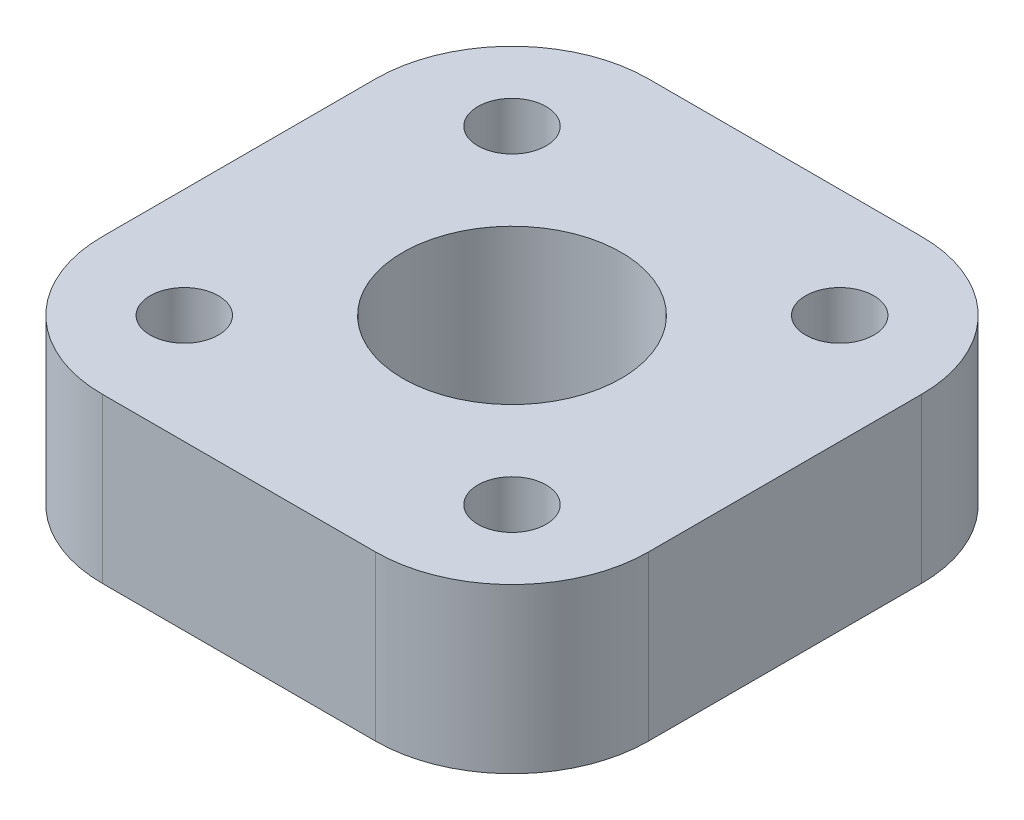
ISO-10303-21;
HEADER;
FILE_DESCRIPTION(('STEP AP214'),'2;1');
FILE_NAME('part.step','',(''),(''),'','','');
FILE_SCHEMA(('AUTOMOTIVE_DESIGN { 1 0 10303 214 1 1 1 1 }'));
ENDSEC;
DATA;
#1=APPLICATION_CONTEXT('core data for automotive mechanical design processes');
#2=APPLICATION_PROTOCOL_DEFINITION('international standard','automotive_design',2000,#1);
#3=PRODUCT_CONTEXT('',#1,'mechanical');
#4=PRODUCT('Part','Part','',(#3));
#5=PRODUCT_RELATED_PRODUCT_CATEGORY('part','',(#4));
#6=PRODUCT_DEFINITION_FORMATION('','',#4);
#7=PRODUCT_DEFINITION_CONTEXT('part definition',#1,'design');
#8=PRODUCT_DEFINITION('design','',#6,#7);
#9=PRODUCT_DEFINITION_SHAPE('','',#8);
#10=(LENGTH_UNIT() NAMED_UNIT(*) SI_UNIT(.MILLI.,.METRE.));
#11=(NAMED_UNIT(*) PLANE_ANGLE_UNIT() SI_UNIT($,.RADIAN.));
#12=(NAMED_UNIT(*) SI_UNIT($,.STERADIAN.) SOLID_ANGLE_UNIT());
#13=UNCERTAINTY_MEASURE_WITH_UNIT(LENGTH_MEASURE(1.E-05),#10,'distance_accuracy_value','');
#14=(GEOMETRIC_REPRESENTATION_CONTEXT(3) GLOBAL_UNCERTAINTY_ASSIGNED_CONTEXT((#13)) GLOBAL_UNIT_ASSIGNED_CONTEXT((#10,
#11,#12)) REPRESENTATION_CONTEXT('',''));
#15=CARTESIAN_POINT('',(0.,0.,0.));
#16=DIRECTION('',(0.,0.,1.));
#17=DIRECTION('',(1.,0.,0.));
#18=AXIS2_PLACEMENT_3D('',#15,#16,#17);
#19=CARTESIAN_POINT('',(0.,3.,0.));
#20=DIRECTION('',(0.,-1.,0.));
#21=DIRECTION('',(0.,0.,-1.));
#22=AXIS2_PLACEMENT_3D('',#19,#20,#21);
#23=PLANE('',#22);
#24=CARTESIAN_POINT('',(-6.,3.,6.));
#25=DIRECTION('',(0.,1.,0.));
#26=DIRECTION('',(0.,0.,1.));
#27=AXIS2_PLACEMENT_3D('',#24,#25,#26);
#28=CIRCLE('',#27,1.24999999999999);
#29=CARTESIAN_POINT('',(-6.,3.,7.24999999999999));
#30=VERTEX_POINT('',#29);
#31=EDGE_CURVE('E200',#30,#30,#28,.T.);
#32=ORIENTED_EDGE('',*,*,#31,.F.);
#33=EDGE_LOOP('',(#32));
#34=FACE_BOUND('',#33,.T.);
#35=DIRECTION('',(0.,0.,-1.));
#36=VECTOR('',#35,1.);
#37=CARTESIAN_POINT('',(10.,3.,10.));
#38=LINE('',#37,#36);
#39=CARTESIAN_POINT('',(10.,3.,5.));
#40=VERTEX_POINT('',#39);
#41=CARTESIAN_POINT('',(10.,3.,-5.));
#42=VERTEX_POINT('',#41);
#43=EDGE_CURVE('E143',#40,#42,#38,.T.);
#44=ORIENTED_EDGE('',*,*,#43,.T.);
#45=CARTESIAN_POINT('',(5.,3.,-5.));
#46=DIRECTION('',(0.,-1.,0.));
#47=DIRECTION('',(0.,0.,-1.));
#48=AXIS2_PLACEMENT_3D('',#45,#46,#47);
#49=CIRCLE('',#48,5.);
#50=CARTESIAN_POINT('',(5.,3.,-10.));
#51=VERTEX_POINT('',#50);
#52=EDGE_CURVE('E157',#42,#51,#49,.F.);
#53=ORIENTED_EDGE('',*,*,#52,.T.);
#54=DIRECTION('',(-1.,0.,0.));
#55=VECTOR('',#54,1.);
#56=CARTESIAN_POINT('',(-10.,3.,-10.));
#57=LINE('',#56,#55);
#58=CARTESIAN_POINT('',(-5.,3.,-10.));
#59=VERTEX_POINT('',#58);
#60=EDGE_CURVE('E124',#51,#59,#57,.T.);
#61=ORIENTED_EDGE('',*,*,#60,.T.);
#62=CARTESIAN_POINT('',(-5.,3.,-5.));
#63=DIRECTION('',(0.,-1.,0.));
#64=DIRECTION('',(0.,0.,-1.));
#65=AXIS2_PLACEMENT_3D('',#62,#63,#64);
#66=CIRCLE('',#65,5.);
#67=CARTESIAN_POINT('',(-10.,3.,-5.));
#68=VERTEX_POINT('',#67);
#69=EDGE_CURVE('E153',#59,#68,#66,.F.);
#70=ORIENTED_EDGE('',*,*,#69,.T.);
#71=DIRECTION('',(0.,0.,1.));
#72=VECTOR('',#71,1.);
#73=CARTESIAN_POINT('',(-10.,3.,10.));
#74=LINE('',#73,#72);
#75=CARTESIAN_POINT('',(-10.,3.,5.));
#76=VERTEX_POINT('',#75);
#77=EDGE_CURVE('E166',#68,#76,#74,.T.);
#78=ORIENTED_EDGE('',*,*,#77,.T.);
#79=CARTESIAN_POINT('',(-5.,3.,5.));
#80=DIRECTION('',(0.,-1.,0.));
#81=DIRECTION('',(0.,0.,-1.));
#82=AXIS2_PLACEMENT_3D('',#79,#80,#81);
#83=CIRCLE('',#82,5.);
#84=CARTESIAN_POINT('',(-5.,3.,10.));
#85=VERTEX_POINT('',#84);
#86=EDGE_CURVE('E59',#76,#85,#83,.F.);
#87=ORIENTED_EDGE('',*,*,#86,.T.);
#88=DIRECTION('',(1.,0.,0.));
#89=VECTOR('',#88,1.);
#90=CARTESIAN_POINT('',(-10.,3.,10.));
#91=LINE('',#90,#89);
#92=CARTESIAN_POINT('',(5.,3.,10.));
#93=VERTEX_POINT('',#92);
#94=EDGE_CURVE('E144',#85,#93,#91,.T.);
#95=ORIENTED_EDGE('',*,*,#94,.T.);
#96=CARTESIAN_POINT('',(5.,3.,5.));
#97=DIRECTION('',(0.,-1.,0.));
#98=DIRECTION('',(0.,0.,-1.));
#99=AXIS2_PLACEMENT_3D('',#96,#97,#98);
#100=CIRCLE('',#99,5.);
#101=EDGE_CURVE('E155',#93,#40,#100,.F.);
#102=ORIENTED_EDGE('',*,*,#101,.T.);
#103=EDGE_LOOP('',(#44,#53,#61,#70,#78,#87,#95,#102));
#104=FACE_BOUND('',#103,.T.);
#105=CARTESIAN_POINT('',(0.,3.,0.));
#106=DIRECTION('',(0.,1.,0.));
#107=DIRECTION('',(0.,0.,1.));
#108=AXIS2_PLACEMENT_3D('',#105,#106,#107);
#109=CIRCLE('',#108,4.);
#110=CARTESIAN_POINT('',(0.,3.,4.));
#111=VERTEX_POINT('',#110);
#112=EDGE_CURVE('E138',#111,#111,#109,.T.);
#113=ORIENTED_EDGE('',*,*,#112,.F.);
#114=EDGE_LOOP('',(#113));
#115=FACE_BOUND('',#114,.T.);
#116=CARTESIAN_POINT('',(6.,3.,6.));
#117=DIRECTION('',(0.,1.,0.));
#118=DIRECTION('',(0.,0.,1.));
#119=AXIS2_PLACEMENT_3D('',#116,#117,#118);
#120=CIRCLE('',#119,1.24999999999999);
#121=CARTESIAN_POINT('',(6.,3.,7.24999999999999));
#122=VERTEX_POINT('',#121);
#123=EDGE_CURVE('E194',#122,#122,#120,.T.);
#124=ORIENTED_EDGE('',*,*,#123,.F.);
#125=EDGE_LOOP('',(#124));
#126=FACE_BOUND('',#125,.T.);
#127=CARTESIAN_POINT('',(-6.,3.,-6.));
#128=DIRECTION('',(0.,1.,0.));
#129=DIRECTION('',(0.,0.,1.));
#130=AXIS2_PLACEMENT_3D('',#127,#128,#129);
#131=CIRCLE('',#130,1.24999999999999);
#132=CARTESIAN_POINT('',(-6.,3.,-4.75000000000001));
#133=VERTEX_POINT('',#132);
#134=EDGE_CURVE('E206',#133,#133,#131,.T.);
#135=ORIENTED_EDGE('',*,*,#134,.F.);
#136=EDGE_LOOP('',(#135));
#137=FACE_BOUND('',#136,.T.);
#138=CARTESIAN_POINT('',(6.,3.,-6.));
#139=DIRECTION('',(0.,1.,0.));
#140=DIRECTION('',(0.,0.,1.));
#141=AXIS2_PLACEMENT_3D('',#138,#139,#140);
#142=CIRCLE('',#141,1.24999999999999);
#143=CARTESIAN_POINT('',(6.,3.,-4.75000000000001));
#144=VERTEX_POINT('',#143);
#145=EDGE_CURVE('E212',#144,#144,#142,.T.);
#146=ORIENTED_EDGE('',*,*,#145,.F.);
#147=EDGE_LOOP('',(#146));
#148=FACE_BOUND('',#147,.T.);
#149=ADVANCED_FACE('F37',(#34,#104,#115,#126,#137,#148),#23,.F.);
#150=CARTESIAN_POINT('',(0.,-3.,0.));
#151=DIRECTION('',(0.,-1.,0.));
#152=DIRECTION('',(0.,0.,-1.));
#153=AXIS2_PLACEMENT_3D('',#150,#151,#152);
#154=PLANE('',#153);
#155=CARTESIAN_POINT('',(6.,-3.,-6.));
#156=DIRECTION('',(0.,-1.,0.));
#157=DIRECTION('',(0.,0.,-1.));
#158=AXIS2_PLACEMENT_3D('',#155,#156,#157);
#159=CIRCLE('',#158,1.24999999999999);
#160=CARTESIAN_POINT('',(6.,-3.,-7.24999999999999));
#161=VERTEX_POINT('',#160);
#162=EDGE_CURVE('E209',#161,#161,#159,.T.);
#163=ORIENTED_EDGE('',*,*,#162,.F.);
#164=EDGE_LOOP('',(#163));
#165=FACE_BOUND('',#164,.T.);
#166=CARTESIAN_POINT('',(-6.,-3.,-6.));
#167=DIRECTION('',(0.,-1.,0.));
#168=DIRECTION('',(0.,0.,-1.));
#169=AXIS2_PLACEMENT_3D('',#166,#167,#168);
#170=CIRCLE('',#169,1.24999999999999);
#171=CARTESIAN_POINT('',(-6.,-3.,-7.24999999999999));
#172=VERTEX_POINT('',#171);
#173=EDGE_CURVE('E203',#172,#172,#170,.T.);
#174=ORIENTED_EDGE('',*,*,#173,.F.);
#175=EDGE_LOOP('',(#174));
#176=FACE_BOUND('',#175,.T.);
#177=CARTESIAN_POINT('',(-6.,-3.,6.));
#178=DIRECTION('',(0.,-1.,0.));
#179=DIRECTION('',(0.,0.,-1.));
#180=AXIS2_PLACEMENT_3D('',#177,#178,#179);
#181=CIRCLE('',#180,1.24999999999999);
#182=CARTESIAN_POINT('',(-6.,-3.,4.75000000000001));
#183=VERTEX_POINT('',#182);
#184=EDGE_CURVE('E197',#183,#183,#181,.T.);
#185=ORIENTED_EDGE('',*,*,#184,.F.);
#186=EDGE_LOOP('',(#185));
#187=FACE_BOUND('',#186,.T.);
#188=CARTESIAN_POINT('',(6.,-3.,6.));
#189=DIRECTION('',(0.,-1.,0.));
#190=DIRECTION('',(0.,0.,-1.));
#191=AXIS2_PLACEMENT_3D('',#188,#189,#190);
#192=CIRCLE('',#191,1.24999999999999);
#193=CARTESIAN_POINT('',(6.,-3.,4.75000000000001));
#194=VERTEX_POINT('',#193);
#195=EDGE_CURVE('E189',#194,#194,#192,.T.);
#196=ORIENTED_EDGE('',*,*,#195,.F.);
#197=EDGE_LOOP('',(#196));
#198=FACE_BOUND('',#197,.T.);
#199=DIRECTION('',(-1.,0.,0.));
#200=VECTOR('',#199,1.);
#201=CARTESIAN_POINT('',(-10.,-3.,-10.));
#202=LINE('',#201,#200);
#203=CARTESIAN_POINT('',(5.,-3.,-10.));
#204=VERTEX_POINT('',#203);
#205=CARTESIAN_POINT('',(-5.,-3.,-10.));
#206=VERTEX_POINT('',#205);
#207=EDGE_CURVE('E121',#204,#206,#202,.T.);
#208=ORIENTED_EDGE('',*,*,#207,.F.);
#209=CARTESIAN_POINT('',(5.,-3.,-5.));
#210=DIRECTION('',(0.,-1.,0.));
#211=DIRECTION('',(0.,0.,-1.));
#212=AXIS2_PLACEMENT_3D('',#209,#210,#211);
#213=CIRCLE('',#212,5.);
#214=CARTESIAN_POINT('',(10.,-3.,-5.));
#215=VERTEX_POINT('',#214);
#216=EDGE_CURVE('E104',#204,#215,#213,.T.);
#217=ORIENTED_EDGE('',*,*,#216,.T.);
#218=DIRECTION('',(0.,0.,-1.));
#219=VECTOR('',#218,1.);
#220=CARTESIAN_POINT('',(10.,-3.,10.));
#221=LINE('',#220,#219);
#222=CARTESIAN_POINT('',(10.,-3.,5.));
#223=VERTEX_POINT('',#222);
#224=EDGE_CURVE('E133',#223,#215,#221,.T.);
#225=ORIENTED_EDGE('',*,*,#224,.F.);
#226=CARTESIAN_POINT('',(5.,-3.,5.));
#227=DIRECTION('',(0.,-1.,0.));
#228=DIRECTION('',(0.,0.,-1.));
#229=AXIS2_PLACEMENT_3D('',#226,#227,#228);
#230=CIRCLE('',#229,5.);
#231=CARTESIAN_POINT('',(5.,-3.,10.));
#232=VERTEX_POINT('',#231);
#233=EDGE_CURVE('E115',#223,#232,#230,.T.);
#234=ORIENTED_EDGE('',*,*,#233,.T.);
#235=DIRECTION('',(1.,0.,0.));
#236=VECTOR('',#235,1.);
#237=CARTESIAN_POINT('',(-10.,-3.,10.));
#238=LINE('',#237,#236);
#239=CARTESIAN_POINT('',(-5.,-3.,10.));
#240=VERTEX_POINT('',#239);
#241=EDGE_CURVE('E136',#240,#232,#238,.T.);
#242=ORIENTED_EDGE('',*,*,#241,.F.);
#243=CARTESIAN_POINT('',(-5.,-3.,5.));
#244=DIRECTION('',(0.,-1.,0.));
#245=DIRECTION('',(0.,0.,-1.));
#246=AXIS2_PLACEMENT_3D('',#243,#244,#245);
#247=CIRCLE('',#246,5.);
#248=CARTESIAN_POINT('',(-10.,-3.,5.));
#249=VERTEX_POINT('',#248);
#250=EDGE_CURVE('E125',#240,#249,#247,.T.);
#251=ORIENTED_EDGE('',*,*,#250,.T.);
#252=DIRECTION('',(0.,0.,1.));
#253=VECTOR('',#252,1.);
#254=CARTESIAN_POINT('',(-10.,-3.,10.));
#255=LINE('',#254,#253);
#256=CARTESIAN_POINT('',(-10.,-3.,-5.));
#257=VERTEX_POINT('',#256);
#258=EDGE_CURVE('E132',#257,#249,#255,.T.);
#259=ORIENTED_EDGE('',*,*,#258,.F.);
#260=CARTESIAN_POINT('',(-5.,-3.,-5.));
#261=DIRECTION('',(0.,-1.,0.));
#262=DIRECTION('',(0.,0.,-1.));
#263=AXIS2_PLACEMENT_3D('',#260,#261,#262);
#264=CIRCLE('',#263,5.);
#265=EDGE_CURVE('E131',#257,#206,#264,.T.);
#266=ORIENTED_EDGE('',*,*,#265,.T.);
#267=EDGE_LOOP('',(#208,#217,#225,#234,#242,#251,#259,#266));
#268=FACE_BOUND('',#267,.T.);
#269=CARTESIAN_POINT('',(0.,-3.,0.));
#270=DIRECTION('',(0.,1.,0.));
#271=DIRECTION('',(0.,0.,1.));
#272=AXIS2_PLACEMENT_3D('',#269,#270,#271);
#273=CIRCLE('',#272,4.);
#274=CARTESIAN_POINT('',(0.,-3.,4.));
#275=VERTEX_POINT('',#274);
#276=EDGE_CURVE('E186',#275,#275,#273,.T.);
#277=ORIENTED_EDGE('',*,*,#276,.T.);
#278=EDGE_LOOP('',(#277));
#279=FACE_BOUND('',#278,.T.);
#280=ADVANCED_FACE('F128',(#165,#176,#187,#198,#268,#279),#154,.T.);
#281=CARTESIAN_POINT('',(10.,3.,10.));
#282=DIRECTION('',(-1.,0.,0.));
#283=DIRECTION('',(0.,0.,1.));
#284=AXIS2_PLACEMENT_3D('',#281,#282,#283);
#285=PLANE('',#284);
#286=ORIENTED_EDGE('',*,*,#224,.T.);
#287=DIRECTION('',(0.,-1.,0.));
#288=VECTOR('',#287,1.);
#289=CARTESIAN_POINT('',(10.,3.,-5.));
#290=LINE('',#289,#288);
#291=EDGE_CURVE('E109',#215,#42,#290,.F.);
#292=ORIENTED_EDGE('',*,*,#291,.T.);
#293=ORIENTED_EDGE('',*,*,#43,.F.);
#294=DIRECTION('',(0.,-1.,0.));
#295=VECTOR('',#294,1.);
#296=CARTESIAN_POINT('',(10.,3.,5.));
#297=LINE('',#296,#295);
#298=EDGE_CURVE('E114',#40,#223,#297,.T.);
#299=ORIENTED_EDGE('',*,*,#298,.T.);
#300=EDGE_LOOP('',(#286,#292,#293,#299));
#301=FACE_BOUND('',#300,.T.);
#302=ADVANCED_FACE('F182',(#301),#285,.F.);
#303=CARTESIAN_POINT('',(-10.,3.,-10.));
#304=DIRECTION('',(0.,0.,1.));
#305=DIRECTION('',(1.,0.,0.));
#306=AXIS2_PLACEMENT_3D('',#303,#304,#305);
#307=PLANE('',#306);
#308=ORIENTED_EDGE('',*,*,#60,.F.);
#309=DIRECTION('',(0.,-1.,0.));
#310=VECTOR('',#309,1.);
#311=CARTESIAN_POINT('',(5.,3.,-10.));
#312=LINE('',#311,#310);
#313=EDGE_CURVE('E108',#51,#204,#312,.T.);
#314=ORIENTED_EDGE('',*,*,#313,.T.);
#315=ORIENTED_EDGE('',*,*,#207,.T.);
#316=DIRECTION('',(0.,-1.,0.));
#317=VECTOR('',#316,1.);
#318=CARTESIAN_POINT('',(-5.,3.,-10.));
#319=LINE('',#318,#317);
#320=EDGE_CURVE('E126',#206,#59,#319,.F.);
#321=ORIENTED_EDGE('',*,*,#320,.T.);
#322=EDGE_LOOP('',(#308,#314,#315,#321));
#323=FACE_BOUND('',#322,.T.);
#324=ADVANCED_FACE('F120',(#323),#307,.F.);
#325=CARTESIAN_POINT('',(-10.,3.,10.));
#326=DIRECTION('',(1.,0.,0.));
#327=DIRECTION('',(0.,0.,-1.));
#328=AXIS2_PLACEMENT_3D('',#325,#326,#327);
#329=PLANE('',#328);
#330=ORIENTED_EDGE('',*,*,#77,.F.);
#331=DIRECTION('',(0.,-1.,0.));
#332=VECTOR('',#331,1.);
#333=CARTESIAN_POINT('',(-10.,3.,-5.));
#334=LINE('',#333,#332);
#335=EDGE_CURVE('E11',#68,#257,#334,.T.);
#336=ORIENTED_EDGE('',*,*,#335,.T.);
#337=ORIENTED_EDGE('',*,*,#258,.T.);
#338=DIRECTION('',(0.,-1.,0.));
#339=VECTOR('',#338,1.);
#340=CARTESIAN_POINT('',(-10.,3.,5.));
#341=LINE('',#340,#339);
#342=EDGE_CURVE('E45',#249,#76,#341,.F.);
#343=ORIENTED_EDGE('',*,*,#342,.T.);
#344=EDGE_LOOP('',(#330,#336,#337,#343));
#345=FACE_BOUND('',#344,.T.);
#346=ADVANCED_FACE('F165',(#345),#329,.F.);
#347=CARTESIAN_POINT('',(-10.,3.,10.));
#348=DIRECTION('',(0.,0.,-1.));
#349=DIRECTION('',(-1.,0.,0.));
#350=AXIS2_PLACEMENT_3D('',#347,#348,#349);
#351=PLANE('',#350);
#352=ORIENTED_EDGE('',*,*,#241,.T.);
#353=DIRECTION('',(0.,-1.,0.));
#354=VECTOR('',#353,1.);
#355=CARTESIAN_POINT('',(5.,3.,10.));
#356=LINE('',#355,#354);
#357=EDGE_CURVE('E52',#232,#93,#356,.F.);
#358=ORIENTED_EDGE('',*,*,#357,.T.);
#359=ORIENTED_EDGE('',*,*,#94,.F.);
#360=DIRECTION('',(0.,-1.,0.));
#361=VECTOR('',#360,1.);
#362=CARTESIAN_POINT('',(-5.,3.,10.));
#363=LINE('',#362,#361);
#364=EDGE_CURVE('E159',#85,#240,#363,.T.);
#365=ORIENTED_EDGE('',*,*,#364,.T.);
#366=EDGE_LOOP('',(#352,#358,#359,#365));
#367=FACE_BOUND('',#366,.T.);
#368=ADVANCED_FACE('F175',(#367),#351,.F.);
#369=CARTESIAN_POINT('',(0.,3.,0.));
#370=DIRECTION('',(0.,-1.,0.));
#371=DIRECTION('',(0.,0.,-1.));
#372=AXIS2_PLACEMENT_3D('',#369,#370,#371);
#373=CYLINDRICAL_SURFACE('',#372,4.);
#374=ORIENTED_EDGE('',*,*,#112,.T.);
#375=EDGE_LOOP('',(#374));
#376=FACE_BOUND('',#375,.T.);
#377=ORIENTED_EDGE('',*,*,#276,.F.);
#378=EDGE_LOOP('',(#377));
#379=FACE_BOUND('',#378,.T.);
#380=ADVANCED_FACE('F229',(#376,#379),#373,.F.);
#381=CARTESIAN_POINT('',(6.,3.,6.));
#382=DIRECTION('',(0.,1.,0.));
#383=DIRECTION('',(0.,0.,1.));
#384=AXIS2_PLACEMENT_3D('',#381,#382,#383);
#385=CYLINDRICAL_SURFACE('',#384,1.24999999999999);
#386=ORIENTED_EDGE('',*,*,#123,.T.);
#387=EDGE_LOOP('',(#386));
#388=FACE_BOUND('',#387,.T.);
#389=ORIENTED_EDGE('',*,*,#195,.T.);
#390=EDGE_LOOP('',(#389));
#391=FACE_BOUND('',#390,.T.);
#392=ADVANCED_FACE('F337',(#388,#391),#385,.F.);
#393=CARTESIAN_POINT('',(-6.,3.,6.));
#394=DIRECTION('',(0.,1.,0.));
#395=DIRECTION('',(0.,0.,1.));
#396=AXIS2_PLACEMENT_3D('',#393,#394,#395);
#397=CYLINDRICAL_SURFACE('',#396,1.24999999999999);
#398=ORIENTED_EDGE('',*,*,#31,.T.);
#399=EDGE_LOOP('',(#398));
#400=FACE_BOUND('',#399,.T.);
#401=ORIENTED_EDGE('',*,*,#184,.T.);
#402=EDGE_LOOP('',(#401));
#403=FACE_BOUND('',#402,.T.);
#404=ADVANCED_FACE('F325',(#400,#403),#397,.F.);
#405=CARTESIAN_POINT('',(-6.,3.,-6.));
#406=DIRECTION('',(0.,1.,0.));
#407=DIRECTION('',(0.,0.,1.));
#408=AXIS2_PLACEMENT_3D('',#405,#406,#407);
#409=CYLINDRICAL_SURFACE('',#408,1.24999999999999);
#410=ORIENTED_EDGE('',*,*,#134,.T.);
#411=EDGE_LOOP('',(#410));
#412=FACE_BOUND('',#411,.T.);
#413=ORIENTED_EDGE('',*,*,#173,.T.);
#414=EDGE_LOOP('',(#413));
#415=FACE_BOUND('',#414,.T.);
#416=ADVANCED_FACE('F315',(#412,#415),#409,.F.);
#417=CARTESIAN_POINT('',(6.,3.,-6.));
#418=DIRECTION('',(0.,1.,0.));
#419=DIRECTION('',(0.,0.,1.));
#420=AXIS2_PLACEMENT_3D('',#417,#418,#419);
#421=CYLINDRICAL_SURFACE('',#420,1.24999999999999);
#422=ORIENTED_EDGE('',*,*,#145,.T.);
#423=EDGE_LOOP('',(#422));
#424=FACE_BOUND('',#423,.T.);
#425=ORIENTED_EDGE('',*,*,#162,.T.);
#426=EDGE_LOOP('',(#425));
#427=FACE_BOUND('',#426,.T.);
#428=ADVANCED_FACE('F216',(#424,#427),#421,.F.);
#429=CARTESIAN_POINT('',(5.,3.,-5.));
#430=DIRECTION('',(0.,-1.,0.));
#431=DIRECTION('',(0.,0.,-1.));
#432=AXIS2_PLACEMENT_3D('',#429,#430,#431);
#433=CYLINDRICAL_SURFACE('',#432,5.);
#434=ORIENTED_EDGE('',*,*,#52,.F.);
#435=ORIENTED_EDGE('',*,*,#291,.F.);
#436=ORIENTED_EDGE('',*,*,#216,.F.);
#437=ORIENTED_EDGE('',*,*,#313,.F.);
#438=EDGE_LOOP('',(#434,#435,#436,#437));
#439=FACE_BOUND('',#438,.T.);
#440=ADVANCED_FACE('F107',(#439),#433,.T.);
#441=CARTESIAN_POINT('',(5.,3.,5.));
#442=DIRECTION('',(0.,-1.,0.));
#443=DIRECTION('',(0.,0.,-1.));
#444=AXIS2_PLACEMENT_3D('',#441,#442,#443);
#445=CYLINDRICAL_SURFACE('',#444,5.);
#446=ORIENTED_EDGE('',*,*,#101,.F.);
#447=ORIENTED_EDGE('',*,*,#357,.F.);
#448=ORIENTED_EDGE('',*,*,#233,.F.);
#449=ORIENTED_EDGE('',*,*,#298,.F.);
#450=EDGE_LOOP('',(#446,#447,#448,#449));
#451=FACE_BOUND('',#450,.T.);
#452=ADVANCED_FACE('F179',(#451),#445,.T.);
#453=CARTESIAN_POINT('',(-5.,3.,-5.));
#454=DIRECTION('',(0.,-1.,0.));
#455=DIRECTION('',(0.,0.,-1.));
#456=AXIS2_PLACEMENT_3D('',#453,#454,#455);
#457=CYLINDRICAL_SURFACE('',#456,5.);
#458=ORIENTED_EDGE('',*,*,#69,.F.);
#459=ORIENTED_EDGE('',*,*,#320,.F.);
#460=ORIENTED_EDGE('',*,*,#265,.F.);
#461=ORIENTED_EDGE('',*,*,#335,.F.);
#462=EDGE_LOOP('',(#458,#459,#460,#461));
#463=FACE_BOUND('',#462,.T.);
#464=ADVANCED_FACE('F243',(#463),#457,.T.);
#465=CARTESIAN_POINT('',(-5.,3.,5.));
#466=DIRECTION('',(0.,-1.,0.));
#467=DIRECTION('',(0.,0.,-1.));
#468=AXIS2_PLACEMENT_3D('',#465,#466,#467);
#469=CYLINDRICAL_SURFACE('',#468,5.);
#470=ORIENTED_EDGE('',*,*,#86,.F.);
#471=ORIENTED_EDGE('',*,*,#342,.F.);
#472=ORIENTED_EDGE('',*,*,#250,.F.);
#473=ORIENTED_EDGE('',*,*,#364,.F.);
#474=EDGE_LOOP('',(#470,#471,#472,#473));
#475=FACE_BOUND('',#474,.T.);
#476=ADVANCED_FACE('F39',(#475),#469,.T.);
#477=CLOSED_SHELL('',(#149,#280,#302,#324,#346,#368,#380,#392,#404,#416,#428,#440,#452,#464,#476));
#478=MANIFOLD_SOLID_BREP('B2',#477);
#479=ADVANCED_BREP_SHAPE_REPRESENTATION('',(#18,#478),#14);
#480=SHAPE_DEFINITION_REPRESENTATION(#9,#479);
ENDSEC;
END-ISO-10303-21;
